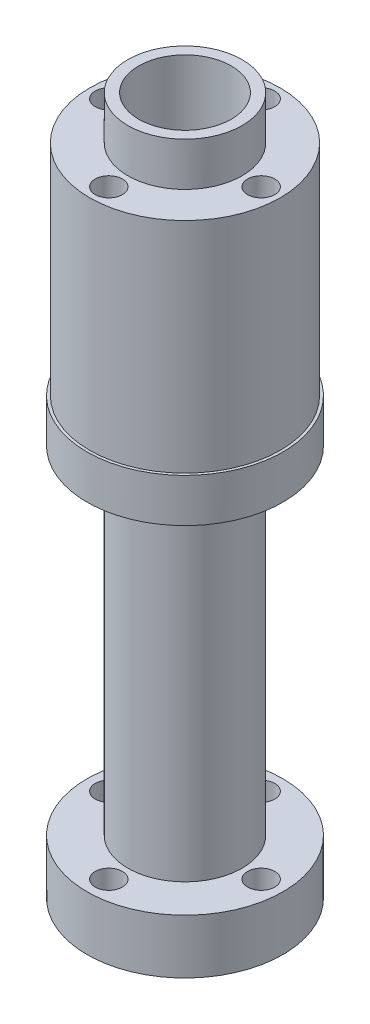
ISO-10303-21;
HEADER;
FILE_DESCRIPTION(('STEP AP214'),'2;1');
FILE_NAME('part.step','',(''),(''),'','','');
FILE_SCHEMA(('AUTOMOTIVE_DESIGN { 1 0 10303 214 1 1 1 1 }'));
ENDSEC;
DATA;
#1=APPLICATION_CONTEXT('core data for automotive mechanical design processes');
#2=APPLICATION_PROTOCOL_DEFINITION('international standard','automotive_design',2000,#1);
#3=PRODUCT_CONTEXT('',#1,'mechanical');
#4=PRODUCT('Part','Part','',(#3));
#5=PRODUCT_RELATED_PRODUCT_CATEGORY('part','',(#4));
#6=PRODUCT_DEFINITION_FORMATION('','',#4);
#7=PRODUCT_DEFINITION_CONTEXT('part definition',#1,'design');
#8=PRODUCT_DEFINITION('design','',#6,#7);
#9=PRODUCT_DEFINITION_SHAPE('','',#8);
#10=(LENGTH_UNIT() NAMED_UNIT(*) SI_UNIT(.MILLI.,.METRE.));
#11=(NAMED_UNIT(*) PLANE_ANGLE_UNIT() SI_UNIT($,.RADIAN.));
#12=(NAMED_UNIT(*) SI_UNIT($,.STERADIAN.) SOLID_ANGLE_UNIT());
#13=UNCERTAINTY_MEASURE_WITH_UNIT(LENGTH_MEASURE(1.E-05),#10,'distance_accuracy_value','');
#14=(GEOMETRIC_REPRESENTATION_CONTEXT(3) GLOBAL_UNCERTAINTY_ASSIGNED_CONTEXT((#13)) GLOBAL_UNIT_ASSIGNED_CONTEXT((#10,
#11,#12)) REPRESENTATION_CONTEXT('',''));
#15=CARTESIAN_POINT('',(0.,0.,0.));
#16=DIRECTION('',(0.,0.,1.));
#17=DIRECTION('',(1.,0.,0.));
#18=AXIS2_PLACEMENT_3D('',#15,#16,#17);
#19=CARTESIAN_POINT('',(-4.25,60.1,0.));
#20=DIRECTION('',(0.,-1.,0.));
#21=DIRECTION('',(0.,0.,-1.));
#22=AXIS2_PLACEMENT_3D('',#19,#20,#21);
#23=PLANE('',#22);
#24=CARTESIAN_POINT('',(0.,60.1,0.));
#25=DIRECTION('',(0.,1.,0.));
#26=DIRECTION('',(0.,0.,1.));
#27=AXIS2_PLACEMENT_3D('',#24,#25,#26);
#28=CIRCLE('',#27,8.75);
#29=CARTESIAN_POINT('',(0.,60.1,8.75));
#30=VERTEX_POINT('',#29);
#31=EDGE_CURVE('E68',#30,#30,#28,.T.);
#32=ORIENTED_EDGE('',*,*,#31,.T.);
#33=EDGE_LOOP('',(#32));
#34=FACE_BOUND('',#33,.T.);
#35=CARTESIAN_POINT('',(0.,60.1,-7.));
#36=DIRECTION('',(0.,1.,0.));
#37=DIRECTION('',(0.,0.,1.));
#38=AXIS2_PLACEMENT_3D('',#35,#36,#37);
#39=CIRCLE('',#38,1.25);
#40=CARTESIAN_POINT('',(0.,60.1,-5.75));
#41=VERTEX_POINT('',#40);
#42=EDGE_CURVE('E102',#41,#41,#39,.T.);
#43=ORIENTED_EDGE('',*,*,#42,.F.);
#44=EDGE_LOOP('',(#43));
#45=FACE_BOUND('',#44,.T.);
#46=CARTESIAN_POINT('',(0.,60.1,7.));
#47=DIRECTION('',(0.,1.,0.));
#48=DIRECTION('',(0.,0.,1.));
#49=AXIS2_PLACEMENT_3D('',#46,#47,#48);
#50=CIRCLE('',#49,1.25);
#51=CARTESIAN_POINT('',(0.,60.1,8.25));
#52=VERTEX_POINT('',#51);
#53=EDGE_CURVE('E108',#52,#52,#50,.T.);
#54=ORIENTED_EDGE('',*,*,#53,.F.);
#55=EDGE_LOOP('',(#54));
#56=FACE_BOUND('',#55,.T.);
#57=CARTESIAN_POINT('',(-7.,60.1,0.));
#58=DIRECTION('',(0.,1.,0.));
#59=DIRECTION('',(0.,0.,1.));
#60=AXIS2_PLACEMENT_3D('',#57,#58,#59);
#61=CIRCLE('',#60,1.25);
#62=CARTESIAN_POINT('',(-7.,60.1,1.25));
#63=VERTEX_POINT('',#62);
#64=EDGE_CURVE('E114',#63,#63,#61,.T.);
#65=ORIENTED_EDGE('',*,*,#64,.F.);
#66=EDGE_LOOP('',(#65));
#67=FACE_BOUND('',#66,.T.);
#68=CARTESIAN_POINT('',(7.,60.1,0.));
#69=DIRECTION('',(0.,1.,0.));
#70=DIRECTION('',(0.,0.,1.));
#71=AXIS2_PLACEMENT_3D('',#68,#69,#70);
#72=CIRCLE('',#71,1.25);
#73=CARTESIAN_POINT('',(7.,60.1,1.25));
#74=VERTEX_POINT('',#73);
#75=EDGE_CURVE('E97',#74,#74,#72,.T.);
#76=ORIENTED_EDGE('',*,*,#75,.F.);
#77=EDGE_LOOP('',(#76));
#78=FACE_BOUND('',#77,.T.);
#79=CARTESIAN_POINT('',(0.,60.1,0.));
#80=DIRECTION('',(0.,-1.,0.));
#81=DIRECTION('',(0.,0.,-1.));
#82=AXIS2_PLACEMENT_3D('',#79,#80,#81);
#83=CIRCLE('',#82,5.25);
#84=CARTESIAN_POINT('',(0.,60.1,-5.25));
#85=VERTEX_POINT('',#84);
#86=EDGE_CURVE('E12',#85,#85,#83,.F.);
#87=ORIENTED_EDGE('',*,*,#86,.F.);
#88=EDGE_LOOP('',(#87));
#89=FACE_BOUND('',#88,.T.);
#90=ADVANCED_FACE('F39',(#34,#45,#56,#67,#78,#89),#23,.F.);
#91=CARTESIAN_POINT('',(0.,0.,0.));
#92=DIRECTION('',(0.,-1.,0.));
#93=DIRECTION('',(0.,0.,-1.));
#94=AXIS2_PLACEMENT_3D('',#91,#92,#93);
#95=CYLINDRICAL_SURFACE('',#94,9.);
#96=CARTESIAN_POINT('',(0.,36.,0.));
#97=DIRECTION('',(0.,-1.,0.));
#98=DIRECTION('',(0.,0.,-1.));
#99=AXIS2_PLACEMENT_3D('',#96,#97,#98);
#100=CIRCLE('',#99,9.);
#101=CARTESIAN_POINT('',(0.,36.,-9.));
#102=VERTEX_POINT('',#101);
#103=EDGE_CURVE('E46',#102,#102,#100,.T.);
#104=ORIENTED_EDGE('',*,*,#103,.F.);
#105=EDGE_LOOP('',(#104));
#106=FACE_BOUND('',#105,.T.);
#107=CARTESIAN_POINT('',(0.,40.,0.));
#108=DIRECTION('',(0.,1.,0.));
#109=DIRECTION('',(0.,0.,1.));
#110=AXIS2_PLACEMENT_3D('',#107,#108,#109);
#111=CIRCLE('',#110,9.);
#112=CARTESIAN_POINT('',(0.,40.,9.));
#113=VERTEX_POINT('',#112);
#114=EDGE_CURVE('E58',#113,#113,#111,.T.);
#115=ORIENTED_EDGE('',*,*,#114,.F.);
#116=EDGE_LOOP('',(#115));
#117=FACE_BOUND('',#116,.T.);
#118=ADVANCED_FACE('F146',(#106,#117),#95,.T.);
#119=CARTESIAN_POINT('',(0.,0.,0.));
#120=DIRECTION('',(0.,-1.,0.));
#121=DIRECTION('',(0.,0.,-1.));
#122=AXIS2_PLACEMENT_3D('',#119,#120,#121);
#123=CYLINDRICAL_SURFACE('',#122,4.25);
#124=CARTESIAN_POINT('',(0.,0.,0.));
#125=DIRECTION('',(0.,-1.,0.));
#126=DIRECTION('',(0.,0.,-1.));
#127=AXIS2_PLACEMENT_3D('',#124,#125,#126);
#128=CIRCLE('',#127,4.25);
#129=CARTESIAN_POINT('',(0.,0.,-4.25));
#130=VERTEX_POINT('',#129);
#131=EDGE_CURVE('E101',#130,#130,#128,.T.);
#132=ORIENTED_EDGE('',*,*,#131,.T.);
#133=EDGE_LOOP('',(#132));
#134=FACE_BOUND('',#133,.T.);
#135=CARTESIAN_POINT('',(0.,64.1,0.));
#136=DIRECTION('',(0.,1.,0.));
#137=DIRECTION('',(0.,0.,1.));
#138=AXIS2_PLACEMENT_3D('',#135,#136,#137);
#139=CIRCLE('',#138,4.25);
#140=CARTESIAN_POINT('',(0.,64.1,4.25));
#141=VERTEX_POINT('',#140);
#142=EDGE_CURVE('E371',#141,#141,#139,.T.);
#143=ORIENTED_EDGE('',*,*,#142,.T.);
#144=EDGE_LOOP('',(#143));
#145=FACE_BOUND('',#144,.T.);
#146=ADVANCED_FACE('F41',(#134,#145),#123,.F.);
#147=CARTESIAN_POINT('',(-9.,36.,0.));
#148=DIRECTION('',(0.,1.,0.));
#149=DIRECTION('',(0.,0.,1.));
#150=AXIS2_PLACEMENT_3D('',#147,#148,#149);
#151=PLANE('',#150);
#152=CARTESIAN_POINT('',(0.,36.,0.));
#153=DIRECTION('',(0.,-1.,0.));
#154=DIRECTION('',(0.,0.,-1.));
#155=AXIS2_PLACEMENT_3D('',#152,#153,#154);
#156=CIRCLE('',#155,5.25);
#157=CARTESIAN_POINT('',(0.,36.,-5.25));
#158=VERTEX_POINT('',#157);
#159=EDGE_CURVE('E50',#158,#158,#156,.T.);
#160=ORIENTED_EDGE('',*,*,#159,.F.);
#161=EDGE_LOOP('',(#160));
#162=FACE_BOUND('',#161,.T.);
#163=ORIENTED_EDGE('',*,*,#103,.T.);
#164=EDGE_LOOP('',(#163));
#165=FACE_BOUND('',#164,.T.);
#166=ADVANCED_FACE('F137',(#162,#165),#151,.F.);
#167=CARTESIAN_POINT('',(0.,0.,0.));
#168=DIRECTION('',(0.,-1.,0.));
#169=DIRECTION('',(0.,0.,-1.));
#170=AXIS2_PLACEMENT_3D('',#167,#168,#169);
#171=CYLINDRICAL_SURFACE('',#170,5.25);
#172=CARTESIAN_POINT('',(0.,5.,0.));
#173=DIRECTION('',(0.,-1.,0.));
#174=DIRECTION('',(0.,0.,-1.));
#175=AXIS2_PLACEMENT_3D('',#172,#173,#174);
#176=CIRCLE('',#175,5.25);
#177=CARTESIAN_POINT('',(0.,5.,-5.25));
#178=VERTEX_POINT('',#177);
#179=EDGE_CURVE('E55',#178,#178,#176,.T.);
#180=ORIENTED_EDGE('',*,*,#179,.F.);
#181=EDGE_LOOP('',(#180));
#182=FACE_BOUND('',#181,.T.);
#183=ORIENTED_EDGE('',*,*,#159,.T.);
#184=EDGE_LOOP('',(#183));
#185=FACE_BOUND('',#184,.T.);
#186=ADVANCED_FACE('F134',(#182,#185),#171,.T.);
#187=CARTESIAN_POINT('',(-5.25,5.,0.));
#188=DIRECTION('',(0.,-1.,0.));
#189=DIRECTION('',(0.,0.,-1.));
#190=AXIS2_PLACEMENT_3D('',#187,#188,#189);
#191=PLANE('',#190);
#192=CARTESIAN_POINT('',(0.,5.,-7.));
#193=DIRECTION('',(0.,-1.,0.));
#194=DIRECTION('',(0.,0.,-1.));
#195=AXIS2_PLACEMENT_3D('',#192,#193,#194);
#196=CIRCLE('',#195,1.25);
#197=CARTESIAN_POINT('',(0.,5.,-8.25));
#198=VERTEX_POINT('',#197);
#199=EDGE_CURVE('E94',#198,#198,#196,.F.);
#200=ORIENTED_EDGE('',*,*,#199,.F.);
#201=EDGE_LOOP('',(#200));
#202=FACE_BOUND('',#201,.T.);
#203=CARTESIAN_POINT('',(0.,5.,7.));
#204=DIRECTION('',(0.,-1.,0.));
#205=DIRECTION('',(0.,0.,-1.));
#206=AXIS2_PLACEMENT_3D('',#203,#204,#205);
#207=CIRCLE('',#206,1.25);
#208=CARTESIAN_POINT('',(0.,5.,5.75));
#209=VERTEX_POINT('',#208);
#210=EDGE_CURVE('E91',#209,#209,#207,.F.);
#211=ORIENTED_EDGE('',*,*,#210,.F.);
#212=EDGE_LOOP('',(#211));
#213=FACE_BOUND('',#212,.T.);
#214=CARTESIAN_POINT('',(-7.,5.,0.));
#215=DIRECTION('',(0.,-1.,0.));
#216=DIRECTION('',(0.,0.,-1.));
#217=AXIS2_PLACEMENT_3D('',#214,#215,#216);
#218=CIRCLE('',#217,1.25);
#219=CARTESIAN_POINT('',(-7.,5.,-1.25));
#220=VERTEX_POINT('',#219);
#221=EDGE_CURVE('E88',#220,#220,#218,.F.);
#222=ORIENTED_EDGE('',*,*,#221,.F.);
#223=EDGE_LOOP('',(#222));
#224=FACE_BOUND('',#223,.T.);
#225=CARTESIAN_POINT('',(7.,5.,0.));
#226=DIRECTION('',(0.,-1.,0.));
#227=DIRECTION('',(0.,0.,-1.));
#228=AXIS2_PLACEMENT_3D('',#225,#226,#227);
#229=CIRCLE('',#228,1.25);
#230=CARTESIAN_POINT('',(7.,5.,-1.25));
#231=VERTEX_POINT('',#230);
#232=EDGE_CURVE('E80',#231,#231,#229,.F.);
#233=ORIENTED_EDGE('',*,*,#232,.F.);
#234=EDGE_LOOP('',(#233));
#235=FACE_BOUND('',#234,.T.);
#236=CARTESIAN_POINT('',(0.,5.,0.));
#237=DIRECTION('',(0.,-1.,0.));
#238=DIRECTION('',(0.,0.,-1.));
#239=AXIS2_PLACEMENT_3D('',#236,#237,#238);
#240=CIRCLE('',#239,9.);
#241=CARTESIAN_POINT('',(0.,5.,-9.));
#242=VERTEX_POINT('',#241);
#243=EDGE_CURVE('E127',#242,#242,#240,.T.);
#244=ORIENTED_EDGE('',*,*,#243,.F.);
#245=EDGE_LOOP('',(#244));
#246=FACE_BOUND('',#245,.T.);
#247=ORIENTED_EDGE('',*,*,#179,.T.);
#248=EDGE_LOOP('',(#247));
#249=FACE_BOUND('',#248,.T.);
#250=ADVANCED_FACE('F132',(#202,#213,#224,#235,#246,#249),#191,.F.);
#251=CARTESIAN_POINT('',(0.,0.,0.));
#252=DIRECTION('',(0.,-1.,0.));
#253=DIRECTION('',(0.,0.,-1.));
#254=AXIS2_PLACEMENT_3D('',#251,#252,#253);
#255=CYLINDRICAL_SURFACE('',#254,9.);
#256=CARTESIAN_POINT('',(0.,0.,0.));
#257=DIRECTION('',(0.,-1.,0.));
#258=DIRECTION('',(0.,0.,-1.));
#259=AXIS2_PLACEMENT_3D('',#256,#257,#258);
#260=CIRCLE('',#259,9.);
#261=CARTESIAN_POINT('',(0.,0.,-9.));
#262=VERTEX_POINT('',#261);
#263=EDGE_CURVE('E124',#262,#262,#260,.T.);
#264=ORIENTED_EDGE('',*,*,#263,.F.);
#265=EDGE_LOOP('',(#264));
#266=FACE_BOUND('',#265,.T.);
#267=ORIENTED_EDGE('',*,*,#243,.T.);
#268=EDGE_LOOP('',(#267));
#269=FACE_BOUND('',#268,.T.);
#270=ADVANCED_FACE('F179',(#266,#269),#255,.T.);
#271=CARTESIAN_POINT('',(-4.25,0.,0.));
#272=DIRECTION('',(0.,1.,0.));
#273=DIRECTION('',(0.,0.,1.));
#274=AXIS2_PLACEMENT_3D('',#271,#272,#273);
#275=PLANE('',#274);
#276=CARTESIAN_POINT('',(0.,0.,-7.));
#277=DIRECTION('',(0.,1.,0.));
#278=DIRECTION('',(0.,0.,1.));
#279=AXIS2_PLACEMENT_3D('',#276,#277,#278);
#280=CIRCLE('',#279,1.25);
#281=CARTESIAN_POINT('',(0.,0.,-5.75));
#282=VERTEX_POINT('',#281);
#283=EDGE_CURVE('E77',#282,#282,#280,.T.);
#284=ORIENTED_EDGE('',*,*,#283,.T.);
#285=EDGE_LOOP('',(#284));
#286=FACE_BOUND('',#285,.T.);
#287=CARTESIAN_POINT('',(0.,0.,7.));
#288=DIRECTION('',(0.,1.,0.));
#289=DIRECTION('',(0.,0.,1.));
#290=AXIS2_PLACEMENT_3D('',#287,#288,#289);
#291=CIRCLE('',#290,1.25);
#292=CARTESIAN_POINT('',(0.,0.,8.25));
#293=VERTEX_POINT('',#292);
#294=EDGE_CURVE('E81',#293,#293,#291,.T.);
#295=ORIENTED_EDGE('',*,*,#294,.T.);
#296=EDGE_LOOP('',(#295));
#297=FACE_BOUND('',#296,.T.);
#298=CARTESIAN_POINT('',(-7.,0.,0.));
#299=DIRECTION('',(0.,1.,0.));
#300=DIRECTION('',(0.,0.,1.));
#301=AXIS2_PLACEMENT_3D('',#298,#299,#300);
#302=CIRCLE('',#301,1.25);
#303=CARTESIAN_POINT('',(-7.,0.,1.25));
#304=VERTEX_POINT('',#303);
#305=EDGE_CURVE('E65',#304,#304,#302,.T.);
#306=ORIENTED_EDGE('',*,*,#305,.T.);
#307=EDGE_LOOP('',(#306));
#308=FACE_BOUND('',#307,.T.);
#309=CARTESIAN_POINT('',(7.,0.,0.));
#310=DIRECTION('',(0.,1.,0.));
#311=DIRECTION('',(0.,0.,1.));
#312=AXIS2_PLACEMENT_3D('',#309,#310,#311);
#313=CIRCLE('',#312,1.25);
#314=CARTESIAN_POINT('',(7.,0.,1.25));
#315=VERTEX_POINT('',#314);
#316=EDGE_CURVE('E60',#315,#315,#313,.T.);
#317=ORIENTED_EDGE('',*,*,#316,.T.);
#318=EDGE_LOOP('',(#317));
#319=FACE_BOUND('',#318,.T.);
#320=ORIENTED_EDGE('',*,*,#131,.F.);
#321=EDGE_LOOP('',(#320));
#322=FACE_BOUND('',#321,.T.);
#323=ORIENTED_EDGE('',*,*,#263,.T.);
#324=EDGE_LOOP('',(#323));
#325=FACE_BOUND('',#324,.T.);
#326=ADVANCED_FACE('F169',(#286,#297,#308,#319,#322,#325),#275,.F.);
#327=CARTESIAN_POINT('',(7.,50.1,0.));
#328=DIRECTION('',(0.,1.,0.));
#329=DIRECTION('',(0.,0.,1.));
#330=AXIS2_PLACEMENT_3D('',#327,#328,#329);
#331=CYLINDRICAL_SURFACE('',#330,1.25);
#332=CARTESIAN_POINT('',(7.,50.1,0.));
#333=DIRECTION('',(0.,1.,0.));
#334=DIRECTION('',(0.,0.,1.));
#335=AXIS2_PLACEMENT_3D('',#332,#333,#334);
#336=CIRCLE('',#335,1.25);
#337=CARTESIAN_POINT('',(7.,50.1,1.25));
#338=VERTEX_POINT('',#337);
#339=EDGE_CURVE('E117',#338,#338,#336,.T.);
#340=ORIENTED_EDGE('',*,*,#339,.F.);
#341=EDGE_LOOP('',(#340));
#342=FACE_BOUND('',#341,.T.);
#343=ORIENTED_EDGE('',*,*,#75,.T.);
#344=EDGE_LOOP('',(#343));
#345=FACE_BOUND('',#344,.T.);
#346=ADVANCED_FACE('F166',(#342,#345),#331,.F.);
#347=CARTESIAN_POINT('',(7.,50.1,0.));
#348=DIRECTION('',(0.,1.,0.));
#349=DIRECTION('',(0.,0.,1.));
#350=AXIS2_PLACEMENT_3D('',#347,#348,#349);
#351=PLANE('',#350);
#352=ORIENTED_EDGE('',*,*,#339,.T.);
#353=EDGE_LOOP('',(#352));
#354=FACE_BOUND('',#353,.T.);
#355=ADVANCED_FACE('F168',(#354),#351,.T.);
#356=CARTESIAN_POINT('',(-7.,50.1,0.));
#357=DIRECTION('',(0.,1.,0.));
#358=DIRECTION('',(0.,0.,1.));
#359=AXIS2_PLACEMENT_3D('',#356,#357,#358);
#360=CYLINDRICAL_SURFACE('',#359,1.25);
#361=CARTESIAN_POINT('',(-7.,50.1,0.));
#362=DIRECTION('',(0.,1.,0.));
#363=DIRECTION('',(0.,0.,1.));
#364=AXIS2_PLACEMENT_3D('',#361,#362,#363);
#365=CIRCLE('',#364,1.25);
#366=CARTESIAN_POINT('',(-7.,50.1,1.25));
#367=VERTEX_POINT('',#366);
#368=EDGE_CURVE('E111',#367,#367,#365,.T.);
#369=ORIENTED_EDGE('',*,*,#368,.F.);
#370=EDGE_LOOP('',(#369));
#371=FACE_BOUND('',#370,.T.);
#372=ORIENTED_EDGE('',*,*,#64,.T.);
#373=EDGE_LOOP('',(#372));
#374=FACE_BOUND('',#373,.T.);
#375=ADVANCED_FACE('F176',(#371,#374),#360,.F.);
#376=CARTESIAN_POINT('',(-7.,50.1,0.));
#377=DIRECTION('',(0.,1.,0.));
#378=DIRECTION('',(0.,0.,1.));
#379=AXIS2_PLACEMENT_3D('',#376,#377,#378);
#380=PLANE('',#379);
#381=ORIENTED_EDGE('',*,*,#368,.T.);
#382=EDGE_LOOP('',(#381));
#383=FACE_BOUND('',#382,.T.);
#384=ADVANCED_FACE('F232',(#383),#380,.T.);
#385=CARTESIAN_POINT('',(0.,50.1,7.));
#386=DIRECTION('',(0.,1.,0.));
#387=DIRECTION('',(0.,0.,1.));
#388=AXIS2_PLACEMENT_3D('',#385,#386,#387);
#389=CYLINDRICAL_SURFACE('',#388,1.25);
#390=CARTESIAN_POINT('',(0.,50.1,7.));
#391=DIRECTION('',(0.,1.,0.));
#392=DIRECTION('',(0.,0.,1.));
#393=AXIS2_PLACEMENT_3D('',#390,#391,#392);
#394=CIRCLE('',#393,1.25);
#395=CARTESIAN_POINT('',(0.,50.1,8.25));
#396=VERTEX_POINT('',#395);
#397=EDGE_CURVE('E105',#396,#396,#394,.T.);
#398=ORIENTED_EDGE('',*,*,#397,.F.);
#399=EDGE_LOOP('',(#398));
#400=FACE_BOUND('',#399,.T.);
#401=ORIENTED_EDGE('',*,*,#53,.T.);
#402=EDGE_LOOP('',(#401));
#403=FACE_BOUND('',#402,.T.);
#404=ADVANCED_FACE('F228',(#400,#403),#389,.F.);
#405=CARTESIAN_POINT('',(0.,50.1,7.));
#406=DIRECTION('',(0.,1.,0.));
#407=DIRECTION('',(0.,0.,1.));
#408=AXIS2_PLACEMENT_3D('',#405,#406,#407);
#409=PLANE('',#408);
#410=ORIENTED_EDGE('',*,*,#397,.T.);
#411=EDGE_LOOP('',(#410));
#412=FACE_BOUND('',#411,.T.);
#413=ADVANCED_FACE('F224',(#412),#409,.T.);
#414=CARTESIAN_POINT('',(0.,50.1,-7.));
#415=DIRECTION('',(0.,1.,0.));
#416=DIRECTION('',(0.,0.,1.));
#417=AXIS2_PLACEMENT_3D('',#414,#415,#416);
#418=CYLINDRICAL_SURFACE('',#417,1.25);
#419=CARTESIAN_POINT('',(0.,50.1,-7.));
#420=DIRECTION('',(0.,1.,0.));
#421=DIRECTION('',(0.,0.,1.));
#422=AXIS2_PLACEMENT_3D('',#419,#420,#421);
#423=CIRCLE('',#422,1.25);
#424=CARTESIAN_POINT('',(0.,50.1,-5.75));
#425=VERTEX_POINT('',#424);
#426=EDGE_CURVE('E98',#425,#425,#423,.T.);
#427=ORIENTED_EDGE('',*,*,#426,.F.);
#428=EDGE_LOOP('',(#427));
#429=FACE_BOUND('',#428,.T.);
#430=ORIENTED_EDGE('',*,*,#42,.T.);
#431=EDGE_LOOP('',(#430));
#432=FACE_BOUND('',#431,.T.);
#433=ADVANCED_FACE('F216',(#429,#432),#418,.F.);
#434=CARTESIAN_POINT('',(0.,50.1,-7.));
#435=DIRECTION('',(0.,1.,0.));
#436=DIRECTION('',(0.,0.,1.));
#437=AXIS2_PLACEMENT_3D('',#434,#435,#436);
#438=PLANE('',#437);
#439=ORIENTED_EDGE('',*,*,#426,.T.);
#440=EDGE_LOOP('',(#439));
#441=FACE_BOUND('',#440,.T.);
#442=ADVANCED_FACE('F206',(#441),#438,.T.);
#443=CARTESIAN_POINT('',(7.,6.,0.));
#444=DIRECTION('',(0.,-1.,0.));
#445=DIRECTION('',(0.,0.,-1.));
#446=AXIS2_PLACEMENT_3D('',#443,#444,#445);
#447=CYLINDRICAL_SURFACE('',#446,1.25);
#448=ORIENTED_EDGE('',*,*,#316,.F.);
#449=EDGE_LOOP('',(#448));
#450=FACE_BOUND('',#449,.T.);
#451=ORIENTED_EDGE('',*,*,#232,.T.);
#452=EDGE_LOOP('',(#451));
#453=FACE_BOUND('',#452,.T.);
#454=ADVANCED_FACE('F203',(#450,#453),#447,.F.);
#455=CARTESIAN_POINT('',(-7.,6.,0.));
#456=DIRECTION('',(0.,-1.,0.));
#457=DIRECTION('',(0.,0.,-1.));
#458=AXIS2_PLACEMENT_3D('',#455,#456,#457);
#459=CYLINDRICAL_SURFACE('',#458,1.25);
#460=ORIENTED_EDGE('',*,*,#305,.F.);
#461=EDGE_LOOP('',(#460));
#462=FACE_BOUND('',#461,.T.);
#463=ORIENTED_EDGE('',*,*,#221,.T.);
#464=EDGE_LOOP('',(#463));
#465=FACE_BOUND('',#464,.T.);
#466=ADVANCED_FACE('F205',(#462,#465),#459,.F.);
#467=CARTESIAN_POINT('',(0.,6.,7.));
#468=DIRECTION('',(0.,-1.,0.));
#469=DIRECTION('',(0.,0.,-1.));
#470=AXIS2_PLACEMENT_3D('',#467,#468,#469);
#471=CYLINDRICAL_SURFACE('',#470,1.25);
#472=ORIENTED_EDGE('',*,*,#294,.F.);
#473=EDGE_LOOP('',(#472));
#474=FACE_BOUND('',#473,.T.);
#475=ORIENTED_EDGE('',*,*,#210,.T.);
#476=EDGE_LOOP('',(#475));
#477=FACE_BOUND('',#476,.T.);
#478=ADVANCED_FACE('F213',(#474,#477),#471,.F.);
#479=CARTESIAN_POINT('',(0.,6.,-7.));
#480=DIRECTION('',(0.,-1.,0.));
#481=DIRECTION('',(0.,0.,-1.));
#482=AXIS2_PLACEMENT_3D('',#479,#480,#481);
#483=CYLINDRICAL_SURFACE('',#482,1.25);
#484=ORIENTED_EDGE('',*,*,#283,.F.);
#485=EDGE_LOOP('',(#484));
#486=FACE_BOUND('',#485,.T.);
#487=ORIENTED_EDGE('',*,*,#199,.T.);
#488=EDGE_LOOP('',(#487));
#489=FACE_BOUND('',#488,.T.);
#490=ADVANCED_FACE('F299',(#486,#489),#483,.F.);
#491=CARTESIAN_POINT('',(-9.,40.,0.));
#492=DIRECTION('',(0.,1.,0.));
#493=DIRECTION('',(0.,0.,1.));
#494=AXIS2_PLACEMENT_3D('',#491,#492,#493);
#495=PLANE('',#494);
#496=CARTESIAN_POINT('',(0.,40.,0.));
#497=DIRECTION('',(0.,1.,0.));
#498=DIRECTION('',(0.,0.,1.));
#499=AXIS2_PLACEMENT_3D('',#496,#497,#498);
#500=CIRCLE('',#499,8.75);
#501=CARTESIAN_POINT('',(0.,40.,8.75));
#502=VERTEX_POINT('',#501);
#503=EDGE_CURVE('E61',#502,#502,#500,.F.);
#504=ORIENTED_EDGE('',*,*,#503,.T.);
#505=EDGE_LOOP('',(#504));
#506=FACE_BOUND('',#505,.T.);
#507=ORIENTED_EDGE('',*,*,#114,.T.);
#508=EDGE_LOOP('',(#507));
#509=FACE_BOUND('',#508,.T.);
#510=ADVANCED_FACE('F309',(#506,#509),#495,.T.);
#511=CARTESIAN_POINT('',(0.,10.2895974360571,0.));
#512=DIRECTION('',(0.,1.,0.));
#513=DIRECTION('',(0.,0.,1.));
#514=AXIS2_PLACEMENT_3D('',#511,#512,#513);
#515=CYLINDRICAL_SURFACE('',#514,8.75);
#516=CARTESIAN_POINT('',(0.,40.,8.75));
#517=CARTESIAN_POINT('',(0.,40.209375,8.75));
#518=CARTESIAN_POINT('',(0.,40.41875,8.75));
#519=CARTESIAN_POINT('',(0.,40.8375,8.75));
#520=CARTESIAN_POINT('',(0.,41.046875,8.75));
#521=CARTESIAN_POINT('',(0.,41.465625,8.75));
#522=CARTESIAN_POINT('',(0.,41.675,8.75));
#523=CARTESIAN_POINT('',(0.,42.09375,8.75));
#524=CARTESIAN_POINT('',(0.,42.303125,8.75));
#525=CARTESIAN_POINT('',(0.,42.721875,8.75));
#526=CARTESIAN_POINT('',(0.,42.93125,8.75));
#527=CARTESIAN_POINT('',(0.,43.35,8.75));
#528=CARTESIAN_POINT('',(0.,43.559375,8.75));
#529=CARTESIAN_POINT('',(0.,43.978125,8.75));
#530=CARTESIAN_POINT('',(0.,44.1875,8.75));
#531=CARTESIAN_POINT('',(0.,44.60625,8.75));
#532=CARTESIAN_POINT('',(0.,44.815625,8.75));
#533=CARTESIAN_POINT('',(0.,45.234375,8.75));
#534=CARTESIAN_POINT('',(0.,45.44375,8.75));
#535=CARTESIAN_POINT('',(0.,45.8625,8.75));
#536=CARTESIAN_POINT('',(0.,46.071875,8.75));
#537=CARTESIAN_POINT('',(0.,46.490625,8.75));
#538=CARTESIAN_POINT('',(0.,46.7,8.75));
#539=CARTESIAN_POINT('',(0.,47.11875,8.75));
#540=CARTESIAN_POINT('',(0.,47.328125,8.75));
#541=CARTESIAN_POINT('',(0.,47.746875,8.75));
#542=CARTESIAN_POINT('',(0.,47.95625,8.75));
#543=CARTESIAN_POINT('',(0.,48.375,8.75));
#544=CARTESIAN_POINT('',(0.,48.584375,8.75));
#545=CARTESIAN_POINT('',(0.,49.003125,8.75));
#546=CARTESIAN_POINT('',(0.,49.2125,8.75));
#547=CARTESIAN_POINT('',(0.,49.63125,8.75));
#548=CARTESIAN_POINT('',(0.,49.840625,8.75));
#549=CARTESIAN_POINT('',(0.,50.259375,8.75));
#550=CARTESIAN_POINT('',(0.,50.46875,8.75));
#551=CARTESIAN_POINT('',(0.,50.8875,8.75));
#552=CARTESIAN_POINT('',(0.,51.096875,8.75));
#553=CARTESIAN_POINT('',(0.,51.515625,8.75));
#554=CARTESIAN_POINT('',(0.,51.725,8.75));
#555=CARTESIAN_POINT('',(0.,52.14375,8.75));
#556=CARTESIAN_POINT('',(0.,52.353125,8.75));
#557=CARTESIAN_POINT('',(0.,52.771875,8.75));
#558=CARTESIAN_POINT('',(0.,52.98125,8.75));
#559=CARTESIAN_POINT('',(0.,53.4,8.75));
#560=CARTESIAN_POINT('',(0.,53.609375,8.75));
#561=CARTESIAN_POINT('',(0.,54.028125,8.75));
#562=CARTESIAN_POINT('',(0.,54.2375,8.75));
#563=CARTESIAN_POINT('',(0.,54.65625,8.75));
#564=CARTESIAN_POINT('',(0.,54.865625,8.75));
#565=CARTESIAN_POINT('',(0.,55.284375,8.75));
#566=CARTESIAN_POINT('',(0.,55.49375,8.75));
#567=CARTESIAN_POINT('',(0.,55.9125,8.75));
#568=CARTESIAN_POINT('',(0.,56.121875,8.75));
#569=CARTESIAN_POINT('',(0.,56.540625,8.75));
#570=CARTESIAN_POINT('',(0.,56.75,8.75));
#571=CARTESIAN_POINT('',(0.,57.16875,8.75));
#572=CARTESIAN_POINT('',(0.,57.378125,8.75));
#573=CARTESIAN_POINT('',(0.,57.796875,8.75));
#574=CARTESIAN_POINT('',(0.,58.00625,8.75));
#575=CARTESIAN_POINT('',(0.,58.425,8.75));
#576=CARTESIAN_POINT('',(0.,58.634375,8.75));
#577=CARTESIAN_POINT('',(0.,59.053125,8.75));
#578=CARTESIAN_POINT('',(0.,59.2625,8.75));
#579=CARTESIAN_POINT('',(0.,59.68125,8.75));
#580=CARTESIAN_POINT('',(0.,59.890625,8.75));
#581=CARTESIAN_POINT('',(0.,60.1,8.75));
#582=B_SPLINE_CURVE_WITH_KNOTS('',3,(#516,#517,#518,#519,#520,#521,#522,#523,#524,#525,#526,
#527,#528,#529,#530,#531,#532,#533,#534,#535,#536,#537,#538,#539,#540,#541,#542,#543,#544,#545,
#546,#547,#548,#549,#550,#551,#552,#553,#554,#555,#556,#557,#558,#559,#560,#561,#562,#563,#564,
#565,#566,#567,#568,#569,#570,#571,#572,#573,#574,#575,#576,#577,#578,#579,#580,#581),
.UNSPECIFIED.,.F.,.F.,(4,2,2,2,2,2,2,2,2,2,2,2,2,2,2,2,2,2,2,2,2,2,2,2,2,2,2,2,2,2,2,2,4),(0.,
0.628124999999993,1.25625,1.88437499999999,2.51249999999999,3.14062499999999,3.76874999999999,
4.39687499999999,5.025,5.65312499999999,6.28125,6.909375,7.5375,8.165625,8.79375,9.421875,10.05,
10.678125,11.30625,11.934375,12.5625,13.190625,13.81875,14.446875,15.075,15.703125,16.33125,
16.959375,17.5875,18.215625,18.84375,19.471875,20.1),.UNSPECIFIED.);
#583=EDGE_CURVE('BSEAM325',#502,#30,#582,.T.);
#584=ORIENTED_EDGE('',*,*,#503,.F.);
#585=ORIENTED_EDGE('',*,*,#31,.F.);
#586=ORIENTED_EDGE('',*,*,#583,.T.);
#587=ORIENTED_EDGE('',*,*,#583,.F.);
#588=EDGE_LOOP('',(#584,#586,#585,#587));
#589=FACE_BOUND('',#588,.T.);
#590=ADVANCED_FACE('F325',(#589),#515,.T.);
#591=CARTESIAN_POINT('',(0.,64.1,0.));
#592=DIRECTION('',(0.,1.,0.));
#593=DIRECTION('',(0.,0.,1.));
#594=AXIS2_PLACEMENT_3D('',#591,#592,#593);
#595=PLANE('',#594);
#596=CARTESIAN_POINT('',(0.,64.1,0.));
#597=DIRECTION('',(0.,1.,0.));
#598=DIRECTION('',(0.,0.,1.));
#599=AXIS2_PLACEMENT_3D('',#596,#597,#598);
#600=CIRCLE('',#599,5.25);
#601=CARTESIAN_POINT('',(0.,64.1,5.25));
#602=VERTEX_POINT('',#601);
#603=EDGE_CURVE('E73',#602,#602,#600,.T.);
#604=ORIENTED_EDGE('',*,*,#603,.T.);
#605=EDGE_LOOP('',(#604));
#606=FACE_BOUND('',#605,.T.);
#607=ORIENTED_EDGE('',*,*,#142,.F.);
#608=EDGE_LOOP('',(#607));
#609=FACE_BOUND('',#608,.T.);
#610=ADVANCED_FACE('F333',(#606,#609),#595,.T.);
#611=CARTESIAN_POINT('',(0.,64.1,0.));
#612=DIRECTION('',(0.,-1.,0.));
#613=DIRECTION('',(0.,0.,-1.));
#614=AXIS2_PLACEMENT_3D('',#611,#612,#613);
#615=CYLINDRICAL_SURFACE('',#614,5.25);
#616=ORIENTED_EDGE('',*,*,#603,.F.);
#617=EDGE_LOOP('',(#616));
#618=FACE_BOUND('',#617,.T.);
#619=ORIENTED_EDGE('',*,*,#86,.T.);
#620=EDGE_LOOP('',(#619));
#621=FACE_BOUND('',#620,.T.);
#622=ADVANCED_FACE('F355',(#618,#621),#615,.T.);
#623=CLOSED_SHELL('',(#90,#118,#146,#166,#186,#250,#270,#326,#346,#355,#375,#384,#404,#413,#433,
#442,#454,#466,#478,#490,#510,#590,#610,#622));
#624=MANIFOLD_SOLID_BREP('B2',#623);
#625=ADVANCED_BREP_SHAPE_REPRESENTATION('',(#18,#624),#14);
#626=SHAPE_DEFINITION_REPRESENTATION(#9,#625);
ENDSEC;
END-ISO-10303-21;
